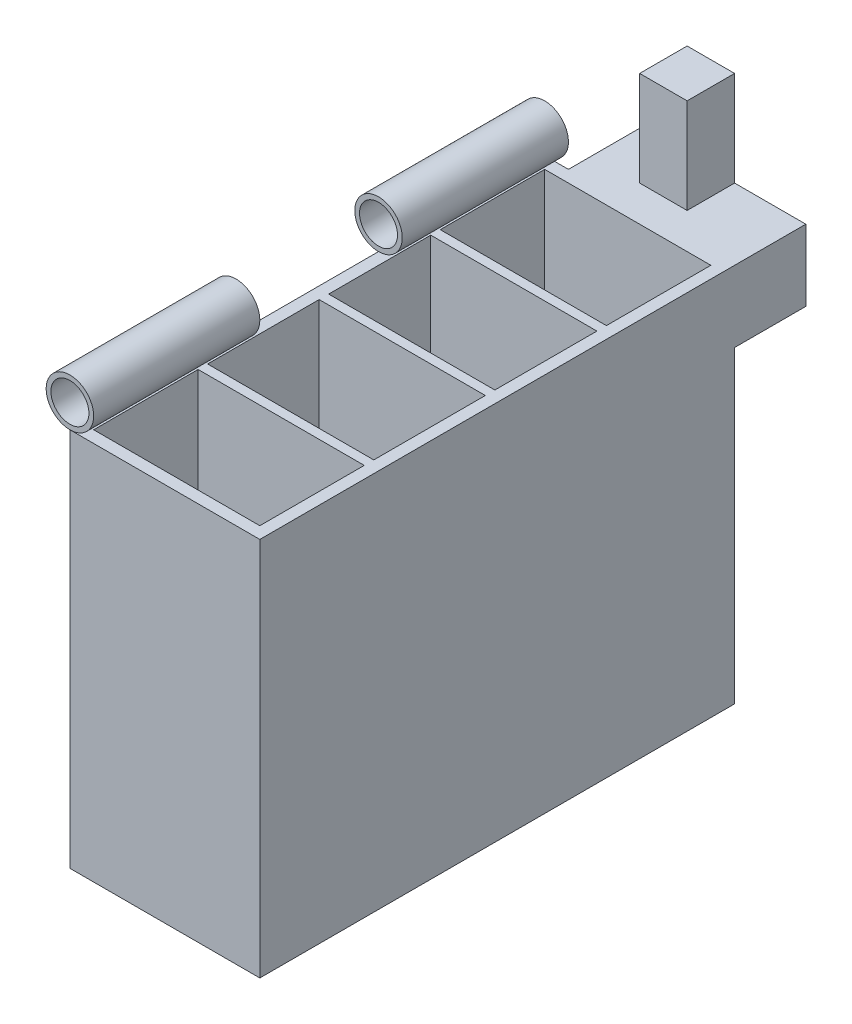
ISO-10303-21;
HEADER;
FILE_DESCRIPTION(('STEP AP214'),'2;1');
FILE_NAME('part.step','',(''),(''),'','','');
FILE_SCHEMA(('AUTOMOTIVE_DESIGN { 1 0 10303 214 1 1 1 1 }'));
ENDSEC;
DATA;
#1=APPLICATION_CONTEXT('core data for automotive mechanical design processes');
#2=APPLICATION_PROTOCOL_DEFINITION('international standard','automotive_design',2000,#1);
#3=PRODUCT_CONTEXT('',#1,'mechanical');
#4=PRODUCT('Part','Part','',(#3));
#5=PRODUCT_RELATED_PRODUCT_CATEGORY('part','',(#4));
#6=PRODUCT_DEFINITION_FORMATION('','',#4);
#7=PRODUCT_DEFINITION_CONTEXT('part definition',#1,'design');
#8=PRODUCT_DEFINITION('design','',#6,#7);
#9=PRODUCT_DEFINITION_SHAPE('','',#8);
#10=(LENGTH_UNIT() NAMED_UNIT(*) SI_UNIT(.MILLI.,.METRE.));
#11=(NAMED_UNIT(*) PLANE_ANGLE_UNIT() SI_UNIT($,.RADIAN.));
#12=(NAMED_UNIT(*) SI_UNIT($,.STERADIAN.) SOLID_ANGLE_UNIT());
#13=UNCERTAINTY_MEASURE_WITH_UNIT(LENGTH_MEASURE(1.E-05),#10,'distance_accuracy_value','');
#14=(GEOMETRIC_REPRESENTATION_CONTEXT(3) GLOBAL_UNCERTAINTY_ASSIGNED_CONTEXT((#13)) GLOBAL_UNIT_ASSIGNED_CONTEXT((#10,
#11,#12)) REPRESENTATION_CONTEXT('',''));
#15=CARTESIAN_POINT('',(0.,0.,0.));
#16=DIRECTION('',(0.,0.,1.));
#17=DIRECTION('',(1.,0.,0.));
#18=AXIS2_PLACEMENT_3D('',#15,#16,#17);
#19=CARTESIAN_POINT('',(-20.,45.,-15.));
#20=DIRECTION('',(0.,0.,-1.));
#21=DIRECTION('',(-1.,0.,0.));
#22=AXIS2_PLACEMENT_3D('',#19,#20,#21);
#23=CYLINDRICAL_SURFACE('',#22,5.);
#24=CARTESIAN_POINT('',(-20.,45.,-15.));
#25=DIRECTION('',(0.,0.,-1.));
#26=DIRECTION('',(-1.,0.,0.));
#27=AXIS2_PLACEMENT_3D('',#24,#25,#26);
#28=CIRCLE('',#27,5.);
#29=CARTESIAN_POINT('',(-25.,45.,-15.));
#30=VERTEX_POINT('',#29);
#31=EDGE_CURVE('E11',#30,#30,#28,.T.);
#32=ORIENTED_EDGE('',*,*,#31,.T.);
#33=EDGE_LOOP('',(#32));
#34=FACE_BOUND('',#33,.T.);
#35=CARTESIAN_POINT('',(-20.,45.,-50.));
#36=DIRECTION('',(0.,0.,-1.));
#37=DIRECTION('',(-1.,0.,0.));
#38=AXIS2_PLACEMENT_3D('',#35,#36,#37);
#39=CIRCLE('',#38,5.);
#40=CARTESIAN_POINT('',(-25.,45.,-50.));
#41=VERTEX_POINT('',#40);
#42=EDGE_CURVE('E44',#41,#41,#39,.T.);
#43=ORIENTED_EDGE('',*,*,#42,.F.);
#44=EDGE_LOOP('',(#43));
#45=FACE_BOUND('',#44,.T.);
#46=ADVANCED_FACE('F41',(#34,#45),#23,.T.);
#47=CARTESIAN_POINT('',(-20.,45.,-15.));
#48=DIRECTION('',(0.,0.,-1.));
#49=DIRECTION('',(-1.,0.,0.));
#50=AXIS2_PLACEMENT_3D('',#47,#48,#49);
#51=PLANE('',#50);
#52=CARTESIAN_POINT('',(-20.,45.,-15.));
#53=DIRECTION('',(0.,0.,-1.));
#54=DIRECTION('',(-1.,0.,0.));
#55=AXIS2_PLACEMENT_3D('',#52,#53,#54);
#56=CIRCLE('',#55,4.);
#57=CARTESIAN_POINT('',(-24.,45.,-15.));
#58=VERTEX_POINT('',#57);
#59=EDGE_CURVE('E51',#58,#58,#56,.T.);
#60=ORIENTED_EDGE('',*,*,#59,.T.);
#61=EDGE_LOOP('',(#60));
#62=FACE_BOUND('',#61,.T.);
#63=ORIENTED_EDGE('',*,*,#31,.F.);
#64=EDGE_LOOP('',(#63));
#65=FACE_BOUND('',#64,.T.);
#66=ADVANCED_FACE('F59',(#62,#65),#51,.F.);
#67=CARTESIAN_POINT('',(-20.,45.,-50.));
#68=DIRECTION('',(0.,0.,-1.));
#69=DIRECTION('',(-1.,0.,0.));
#70=AXIS2_PLACEMENT_3D('',#67,#68,#69);
#71=PLANE('',#70);
#72=CARTESIAN_POINT('',(-20.,45.,-50.));
#73=DIRECTION('',(0.,0.,-1.));
#74=DIRECTION('',(-1.,0.,0.));
#75=AXIS2_PLACEMENT_3D('',#72,#73,#74);
#76=CIRCLE('',#75,4.);
#77=CARTESIAN_POINT('',(-24.,45.,-50.));
#78=VERTEX_POINT('',#77);
#79=EDGE_CURVE('E53',#78,#78,#76,.T.);
#80=ORIENTED_EDGE('',*,*,#79,.F.);
#81=EDGE_LOOP('',(#80));
#82=FACE_BOUND('',#81,.T.);
#83=ORIENTED_EDGE('',*,*,#42,.T.);
#84=EDGE_LOOP('',(#83));
#85=FACE_BOUND('',#84,.T.);
#86=ADVANCED_FACE('F65',(#82,#85),#71,.T.);
#87=CARTESIAN_POINT('',(-20.,45.,-15.));
#88=DIRECTION('',(0.,0.,-1.));
#89=DIRECTION('',(-1.,0.,0.));
#90=AXIS2_PLACEMENT_3D('',#87,#88,#89);
#91=CYLINDRICAL_SURFACE('',#90,4.);
#92=ORIENTED_EDGE('',*,*,#59,.F.);
#93=EDGE_LOOP('',(#92));
#94=FACE_BOUND('',#93,.T.);
#95=ORIENTED_EDGE('',*,*,#79,.T.);
#96=EDGE_LOOP('',(#95));
#97=FACE_BOUND('',#96,.T.);
#98=ADVANCED_FACE('F62',(#94,#97),#91,.F.);
#99=CLOSED_SHELL('',(#46,#66,#86,#98));
#100=MANIFOLD_SOLID_BREP('B2',#99);
#101=CARTESIAN_POINT('',(-20.,45.,50.));
#102=DIRECTION('',(0.,0.,1.));
#103=DIRECTION('',(0.,-1.,0.));
#104=AXIS2_PLACEMENT_3D('',#101,#102,#103);
#105=CYLINDRICAL_SURFACE('',#104,5.);
#106=CARTESIAN_POINT('',(-20.,45.,15.));
#107=DIRECTION('',(0.,0.,1.));
#108=DIRECTION('',(0.,-1.,0.));
#109=AXIS2_PLACEMENT_3D('',#106,#107,#108);
#110=CIRCLE('',#109,5.);
#111=CARTESIAN_POINT('',(-20.,40.,15.));
#112=VERTEX_POINT('',#111);
#113=EDGE_CURVE('E40',#112,#112,#110,.T.);
#114=ORIENTED_EDGE('',*,*,#113,.T.);
#115=EDGE_LOOP('',(#114));
#116=FACE_BOUND('',#115,.T.);
#117=CARTESIAN_POINT('',(-20.,45.,50.));
#118=DIRECTION('',(0.,0.,1.));
#119=DIRECTION('',(0.,-1.,0.));
#120=AXIS2_PLACEMENT_3D('',#117,#118,#119);
#121=CIRCLE('',#120,5.);
#122=CARTESIAN_POINT('',(-20.,40.,50.));
#123=VERTEX_POINT('',#122);
#124=EDGE_CURVE('E117',#123,#123,#121,.T.);
#125=ORIENTED_EDGE('',*,*,#124,.F.);
#126=EDGE_LOOP('',(#125));
#127=FACE_BOUND('',#126,.T.);
#128=ADVANCED_FACE('F111',(#116,#127),#105,.T.);
#129=CARTESIAN_POINT('',(-20.,45.,15.));
#130=DIRECTION('',(0.,0.,1.));
#131=DIRECTION('',(0.,-1.,0.));
#132=AXIS2_PLACEMENT_3D('',#129,#130,#131);
#133=PLANE('',#132);
#134=CARTESIAN_POINT('',(-20.,45.,15.));
#135=DIRECTION('',(0.,0.,1.));
#136=DIRECTION('',(0.,-1.,0.));
#137=AXIS2_PLACEMENT_3D('',#134,#135,#136);
#138=CIRCLE('',#137,4.);
#139=CARTESIAN_POINT('',(-20.,41.,15.));
#140=VERTEX_POINT('',#139);
#141=EDGE_CURVE('E121',#140,#140,#138,.F.);
#142=ORIENTED_EDGE('',*,*,#141,.F.);
#143=EDGE_LOOP('',(#142));
#144=FACE_BOUND('',#143,.T.);
#145=ORIENTED_EDGE('',*,*,#113,.F.);
#146=EDGE_LOOP('',(#145));
#147=FACE_BOUND('',#146,.T.);
#148=ADVANCED_FACE('F136',(#144,#147),#133,.F.);
#149=CARTESIAN_POINT('',(-20.,50.,50.));
#150=DIRECTION('',(0.,0.,-1.));
#151=DIRECTION('',(0.,1.,0.));
#152=AXIS2_PLACEMENT_3D('',#149,#150,#151);
#153=PLANE('',#152);
#154=CARTESIAN_POINT('',(-20.,45.,50.));
#155=DIRECTION('',(0.,0.,1.));
#156=DIRECTION('',(1.,0.,0.));
#157=AXIS2_PLACEMENT_3D('',#154,#155,#156);
#158=CIRCLE('',#157,4.);
#159=CARTESIAN_POINT('',(-16.,45.,50.));
#160=VERTEX_POINT('',#159);
#161=EDGE_CURVE('E125',#160,#160,#158,.T.);
#162=ORIENTED_EDGE('',*,*,#161,.F.);
#163=EDGE_LOOP('',(#162));
#164=FACE_BOUND('',#163,.T.);
#165=ORIENTED_EDGE('',*,*,#124,.T.);
#166=EDGE_LOOP('',(#165));
#167=FACE_BOUND('',#166,.T.);
#168=ADVANCED_FACE('F134',(#164,#167),#153,.F.);
#169=CARTESIAN_POINT('',(-20.,45.,-50.001));
#170=DIRECTION('',(0.,0.,1.));
#171=DIRECTION('',(1.,0.,0.));
#172=AXIS2_PLACEMENT_3D('',#169,#170,#171);
#173=CYLINDRICAL_SURFACE('',#172,4.);
#174=ORIENTED_EDGE('',*,*,#161,.T.);
#175=EDGE_LOOP('',(#174));
#176=FACE_BOUND('',#175,.T.);
#177=ORIENTED_EDGE('',*,*,#141,.T.);
#178=EDGE_LOOP('',(#177));
#179=FACE_BOUND('',#178,.T.);
#180=ADVANCED_FACE('F131',(#176,#179),#173,.F.);
#181=CLOSED_SHELL('',(#128,#148,#168,#180));
#182=MANIFOLD_SOLID_BREP('B6',#181);
#183=CARTESIAN_POINT('',(-20.,40.,50.));
#184=DIRECTION('',(0.,-1.,0.));
#185=DIRECTION('',(0.,0.,-1.));
#186=AXIS2_PLACEMENT_3D('',#183,#184,#185);
#187=PLANE('',#186);
#188=DIRECTION('',(1.,0.,0.));
#189=VECTOR('',#188,1.);
#190=CARTESIAN_POINT('',(-15.,40.,-65.));
#191=LINE('',#190,#189);
#192=CARTESIAN_POINT('',(5.,40.,-65.));
#193=VERTEX_POINT('',#192);
#194=CARTESIAN_POINT('',(20.,40.,-65.));
#195=VERTEX_POINT('',#194);
#196=EDGE_CURVE('E410',#193,#195,#191,.T.);
#197=ORIENTED_EDGE('',*,*,#196,.F.);
#198=DIRECTION('',(0.,0.,1.));
#199=VECTOR('',#198,1.);
#200=CARTESIAN_POINT('',(5.,40.,50.));
#201=LINE('',#200,#199);
#202=CARTESIAN_POINT('',(5.,40.,-55.));
#203=VERTEX_POINT('',#202);
#204=EDGE_CURVE('E386',#193,#203,#201,.T.);
#205=ORIENTED_EDGE('',*,*,#204,.T.);
#206=DIRECTION('',(-1.,0.,0.));
#207=VECTOR('',#206,1.);
#208=CARTESIAN_POINT('',(-20.,40.,-55.));
#209=LINE('',#208,#207);
#210=CARTESIAN_POINT('',(-5.,40.,-55.));
#211=VERTEX_POINT('',#210);
#212=EDGE_CURVE('E382',#203,#211,#209,.T.);
#213=ORIENTED_EDGE('',*,*,#212,.T.);
#214=DIRECTION('',(0.,0.,-1.));
#215=VECTOR('',#214,1.);
#216=CARTESIAN_POINT('',(-5.,40.,50.));
#217=LINE('',#216,#215);
#218=CARTESIAN_POINT('',(-5.,40.,-65.));
#219=VERTEX_POINT('',#218);
#220=EDGE_CURVE('E359',#211,#219,#217,.T.);
#221=ORIENTED_EDGE('',*,*,#220,.T.);
#222=CARTESIAN_POINT('',(-15.,40.,-65.));
#223=VERTEX_POINT('',#222);
#224=EDGE_CURVE('E406',#223,#219,#191,.T.);
#225=ORIENTED_EDGE('',*,*,#224,.F.);
#226=DIRECTION('',(0.,0.,1.));
#227=VECTOR('',#226,1.);
#228=CARTESIAN_POINT('',(-15.,40.,-50.));
#229=LINE('',#228,#227);
#230=CARTESIAN_POINT('',(-15.,40.,-50.));
#231=VERTEX_POINT('',#230);
#232=EDGE_CURVE('E399',#223,#231,#229,.T.);
#233=ORIENTED_EDGE('',*,*,#232,.T.);
#234=DIRECTION('',(-1.,0.,0.));
#235=VECTOR('',#234,1.);
#236=CARTESIAN_POINT('',(-20.,40.,-50.));
#237=LINE('',#236,#235);
#238=CARTESIAN_POINT('',(-20.,40.,-50.));
#239=VERTEX_POINT('',#238);
#240=EDGE_CURVE('E551',#231,#239,#237,.T.);
#241=ORIENTED_EDGE('',*,*,#240,.T.);
#242=DIRECTION('',(0.,0.,-1.));
#243=VECTOR('',#242,1.);
#244=CARTESIAN_POINT('',(-20.,40.,50.));
#245=LINE('',#244,#243);
#246=CARTESIAN_POINT('',(-20.,40.,50.));
#247=VERTEX_POINT('',#246);
#248=EDGE_CURVE('E181',#247,#239,#245,.T.);
#249=ORIENTED_EDGE('',*,*,#248,.F.);
#250=DIRECTION('',(-1.,0.,0.));
#251=VECTOR('',#250,1.);
#252=CARTESIAN_POINT('',(-20.,40.,50.));
#253=LINE('',#252,#251);
#254=CARTESIAN_POINT('',(20.,40.,50.));
#255=VERTEX_POINT('',#254);
#256=EDGE_CURVE('E541',#255,#247,#253,.T.);
#257=ORIENTED_EDGE('',*,*,#256,.F.);
#258=DIRECTION('',(0.,0.,-1.));
#259=VECTOR('',#258,1.);
#260=CARTESIAN_POINT('',(20.,40.,50.));
#261=LINE('',#260,#259);
#262=EDGE_CURVE('E109',#255,#195,#261,.T.);
#263=ORIENTED_EDGE('',*,*,#262,.T.);
#264=EDGE_LOOP('',(#197,#205,#213,#221,#225,#233,#241,#249,#257,#263));
#265=FACE_BOUND('',#264,.T.);
#266=DIRECTION('',(-1.,0.,0.));
#267=VECTOR('',#266,1.);
#268=CARTESIAN_POINT('',(0.,40.,23.5));
#269=LINE('',#268,#267);
#270=CARTESIAN_POINT('',(17.5,40.,23.5));
#271=VERTEX_POINT('',#270);
#272=CARTESIAN_POINT('',(-17.5,40.,23.5));
#273=VERTEX_POINT('',#272);
#274=EDGE_CURVE('E460',#271,#273,#269,.T.);
#275=ORIENTED_EDGE('',*,*,#274,.T.);
#276=DIRECTION('',(0.,0.,1.));
#277=VECTOR('',#276,1.);
#278=CARTESIAN_POINT('',(-17.5,40.,0.));
#279=LINE('',#278,#277);
#280=CARTESIAN_POINT('',(-17.5,40.,0.));
#281=VERTEX_POINT('',#280);
#282=EDGE_CURVE('E451',#281,#273,#279,.T.);
#283=ORIENTED_EDGE('',*,*,#282,.F.);
#284=DIRECTION('',(-1.,0.,0.));
#285=VECTOR('',#284,1.);
#286=CARTESIAN_POINT('',(0.,40.,0.));
#287=LINE('',#286,#285);
#288=CARTESIAN_POINT('',(17.5,40.,0.));
#289=VERTEX_POINT('',#288);
#290=EDGE_CURVE('E467',#289,#281,#287,.T.);
#291=ORIENTED_EDGE('',*,*,#290,.F.);
#292=DIRECTION('',(0.,0.,1.));
#293=VECTOR('',#292,1.);
#294=CARTESIAN_POINT('',(17.5,40.,0.));
#295=LINE('',#294,#293);
#296=EDGE_CURVE('E463',#289,#271,#295,.T.);
#297=ORIENTED_EDGE('',*,*,#296,.T.);
#298=EDGE_LOOP('',(#275,#283,#291,#297));
#299=FACE_BOUND('',#298,.T.);
#300=DIRECTION('',(-1.,0.,0.));
#301=VECTOR('',#300,1.);
#302=CARTESIAN_POINT('',(0.,40.,-25.5));
#303=LINE('',#302,#301);
#304=CARTESIAN_POINT('',(17.5,40.,-25.5));
#305=VERTEX_POINT('',#304);
#306=CARTESIAN_POINT('',(-17.5,40.,-25.5));
#307=VERTEX_POINT('',#306);
#308=EDGE_CURVE('E409',#305,#307,#303,.T.);
#309=ORIENTED_EDGE('',*,*,#308,.T.);
#310=DIRECTION('',(0.,0.,1.));
#311=VECTOR('',#310,1.);
#312=CARTESIAN_POINT('',(-17.5,40.,0.));
#313=LINE('',#312,#311);
#314=CARTESIAN_POINT('',(-17.5,40.,-47.5));
#315=VERTEX_POINT('',#314);
#316=EDGE_CURVE('E513',#315,#307,#313,.T.);
#317=ORIENTED_EDGE('',*,*,#316,.F.);
#318=DIRECTION('',(1.,0.,0.));
#319=VECTOR('',#318,1.);
#320=CARTESIAN_POINT('',(0.,40.,-47.5));
#321=LINE('',#320,#319);
#322=CARTESIAN_POINT('',(17.5,40.,-47.5));
#323=VERTEX_POINT('',#322);
#324=EDGE_CURVE('E526',#315,#323,#321,.T.);
#325=ORIENTED_EDGE('',*,*,#324,.T.);
#326=DIRECTION('',(0.,0.,1.));
#327=VECTOR('',#326,1.);
#328=CARTESIAN_POINT('',(17.5,40.,0.));
#329=LINE('',#328,#327);
#330=EDGE_CURVE('E523',#323,#305,#329,.T.);
#331=ORIENTED_EDGE('',*,*,#330,.T.);
#332=EDGE_LOOP('',(#309,#317,#325,#331));
#333=FACE_BOUND('',#332,.T.);
#334=DIRECTION('',(-1.,0.,0.));
#335=VECTOR('',#334,1.);
#336=CARTESIAN_POINT('',(0.,40.,-2.00000000000003));
#337=LINE('',#336,#335);
#338=CARTESIAN_POINT('',(17.5,40.,-2.00000000000003));
#339=VERTEX_POINT('',#338);
#340=CARTESIAN_POINT('',(-17.5,40.,-2.00000000000003));
#341=VERTEX_POINT('',#340);
#342=EDGE_CURVE('E491',#339,#341,#337,.T.);
#343=ORIENTED_EDGE('',*,*,#342,.T.);
#344=DIRECTION('',(0.,0.,1.));
#345=VECTOR('',#344,1.);
#346=CARTESIAN_POINT('',(-17.5,40.,0.));
#347=LINE('',#346,#345);
#348=CARTESIAN_POINT('',(-17.5,40.,-23.5));
#349=VERTEX_POINT('',#348);
#350=EDGE_CURVE('E482',#349,#341,#347,.T.);
#351=ORIENTED_EDGE('',*,*,#350,.F.);
#352=DIRECTION('',(-1.,0.,0.));
#353=VECTOR('',#352,1.);
#354=CARTESIAN_POINT('',(0.,40.,-23.5));
#355=LINE('',#354,#353);
#356=CARTESIAN_POINT('',(17.5,40.,-23.5));
#357=VERTEX_POINT('',#356);
#358=EDGE_CURVE('E498',#357,#349,#355,.T.);
#359=ORIENTED_EDGE('',*,*,#358,.F.);
#360=DIRECTION('',(0.,0.,1.));
#361=VECTOR('',#360,1.);
#362=CARTESIAN_POINT('',(17.5,40.,0.));
#363=LINE('',#362,#361);
#364=EDGE_CURVE('E494',#357,#339,#363,.T.);
#365=ORIENTED_EDGE('',*,*,#364,.T.);
#366=EDGE_LOOP('',(#343,#351,#359,#365));
#367=FACE_BOUND('',#366,.T.);
#368=DIRECTION('',(0.,0.,1.));
#369=VECTOR('',#368,1.);
#370=CARTESIAN_POINT('',(17.5,40.,0.));
#371=LINE('',#370,#369);
#372=CARTESIAN_POINT('',(17.5,40.,25.5));
#373=VERTEX_POINT('',#372);
#374=CARTESIAN_POINT('',(17.5,40.,47.5));
#375=VERTEX_POINT('',#374);
#376=EDGE_CURVE('E427',#373,#375,#371,.T.);
#377=ORIENTED_EDGE('',*,*,#376,.T.);
#378=DIRECTION('',(1.,0.,0.));
#379=VECTOR('',#378,1.);
#380=CARTESIAN_POINT('',(0.,40.,47.5));
#381=LINE('',#380,#379);
#382=CARTESIAN_POINT('',(-17.5,40.,47.5));
#383=VERTEX_POINT('',#382);
#384=EDGE_CURVE('E417',#383,#375,#381,.T.);
#385=ORIENTED_EDGE('',*,*,#384,.F.);
#386=DIRECTION('',(0.,0.,1.));
#387=VECTOR('',#386,1.);
#388=CARTESIAN_POINT('',(-17.5,40.,0.));
#389=LINE('',#388,#387);
#390=CARTESIAN_POINT('',(-17.5,40.,25.5));
#391=VERTEX_POINT('',#390);
#392=EDGE_CURVE('E434',#391,#383,#389,.T.);
#393=ORIENTED_EDGE('',*,*,#392,.F.);
#394=DIRECTION('',(-1.,0.,0.));
#395=VECTOR('',#394,1.);
#396=CARTESIAN_POINT('',(0.,40.,25.5));
#397=LINE('',#396,#395);
#398=EDGE_CURVE('E430',#373,#391,#397,.T.);
#399=ORIENTED_EDGE('',*,*,#398,.F.);
#400=EDGE_LOOP('',(#377,#385,#393,#399));
#401=FACE_BOUND('',#400,.T.);
#402=ADVANCED_FACE('F173',(#265,#299,#333,#367,#401),#187,.F.);
#403=CARTESIAN_POINT('',(20.,40.,50.));
#404=DIRECTION('',(-1.,0.,0.));
#405=DIRECTION('',(0.,-1.,0.));
#406=AXIS2_PLACEMENT_3D('',#403,#404,#405);
#407=PLANE('',#406);
#408=DIRECTION('',(0.,1.,0.));
#409=VECTOR('',#408,1.);
#410=CARTESIAN_POINT('',(20.,40.,-50.));
#411=LINE('',#410,#409);
#412=CARTESIAN_POINT('',(20.,-40.,-50.));
#413=VERTEX_POINT('',#412);
#414=CARTESIAN_POINT('',(20.,25.,-50.));
#415=VERTEX_POINT('',#414);
#416=EDGE_CURVE('E441',#413,#415,#411,.T.);
#417=ORIENTED_EDGE('',*,*,#416,.T.);
#418=DIRECTION('',(0.,0.,-1.));
#419=VECTOR('',#418,1.);
#420=CARTESIAN_POINT('',(20.,25.,-50.));
#421=LINE('',#420,#419);
#422=CARTESIAN_POINT('',(20.,25.,-65.));
#423=VERTEX_POINT('',#422);
#424=EDGE_CURVE('E196',#415,#423,#421,.T.);
#425=ORIENTED_EDGE('',*,*,#424,.T.);
#426=DIRECTION('',(0.,1.,0.));
#427=VECTOR('',#426,1.);
#428=CARTESIAN_POINT('',(20.,40.,-65.));
#429=LINE('',#428,#427);
#430=EDGE_CURVE('E393',#423,#195,#429,.T.);
#431=ORIENTED_EDGE('',*,*,#430,.T.);
#432=ORIENTED_EDGE('',*,*,#262,.F.);
#433=DIRECTION('',(0.,1.,0.));
#434=VECTOR('',#433,1.);
#435=CARTESIAN_POINT('',(20.,40.,50.));
#436=LINE('',#435,#434);
#437=CARTESIAN_POINT('',(20.,-40.,50.));
#438=VERTEX_POINT('',#437);
#439=EDGE_CURVE('E538',#438,#255,#436,.T.);
#440=ORIENTED_EDGE('',*,*,#439,.F.);
#441=DIRECTION('',(0.,0.,-1.));
#442=VECTOR('',#441,1.);
#443=CARTESIAN_POINT('',(20.,-40.,50.));
#444=LINE('',#443,#442);
#445=EDGE_CURVE('E548',#438,#413,#444,.T.);
#446=ORIENTED_EDGE('',*,*,#445,.T.);
#447=EDGE_LOOP('',(#417,#425,#431,#432,#440,#446));
#448=FACE_BOUND('',#447,.T.);
#449=ADVANCED_FACE('F175',(#448),#407,.F.);
#450=CARTESIAN_POINT('',(-20.,40.,50.));
#451=DIRECTION('',(1.,0.,0.));
#452=DIRECTION('',(0.,1.,0.));
#453=AXIS2_PLACEMENT_3D('',#450,#451,#452);
#454=PLANE('',#453);
#455=DIRECTION('',(0.,-1.,0.));
#456=VECTOR('',#455,1.);
#457=CARTESIAN_POINT('',(-20.,40.,-50.));
#458=LINE('',#457,#456);
#459=CARTESIAN_POINT('',(-20.,-40.,-50.));
#460=VERTEX_POINT('',#459);
#461=EDGE_CURVE('E553',#239,#460,#458,.T.);
#462=ORIENTED_EDGE('',*,*,#461,.T.);
#463=DIRECTION('',(0.,0.,-1.));
#464=VECTOR('',#463,1.);
#465=CARTESIAN_POINT('',(-20.,-40.,50.));
#466=LINE('',#465,#464);
#467=CARTESIAN_POINT('',(-20.,-40.,50.));
#468=VERTEX_POINT('',#467);
#469=EDGE_CURVE('E558',#468,#460,#466,.T.);
#470=ORIENTED_EDGE('',*,*,#469,.F.);
#471=DIRECTION('',(0.,-1.,0.));
#472=VECTOR('',#471,1.);
#473=CARTESIAN_POINT('',(-20.,40.,50.));
#474=LINE('',#473,#472);
#475=EDGE_CURVE('E544',#247,#468,#474,.T.);
#476=ORIENTED_EDGE('',*,*,#475,.F.);
#477=ORIENTED_EDGE('',*,*,#248,.T.);
#478=EDGE_LOOP('',(#462,#470,#476,#477));
#479=FACE_BOUND('',#478,.T.);
#480=ADVANCED_FACE('F565',(#479),#454,.F.);
#481=CARTESIAN_POINT('',(-20.,-40.,50.));
#482=DIRECTION('',(0.,1.,0.));
#483=DIRECTION('',(0.,0.,1.));
#484=AXIS2_PLACEMENT_3D('',#481,#482,#483);
#485=PLANE('',#484);
#486=DIRECTION('',(1.,0.,0.));
#487=VECTOR('',#486,1.);
#488=CARTESIAN_POINT('',(-20.,-40.,-50.));
#489=LINE('',#488,#487);
#490=EDGE_CURVE('E542',#460,#413,#489,.T.);
#491=ORIENTED_EDGE('',*,*,#490,.T.);
#492=ORIENTED_EDGE('',*,*,#445,.F.);
#493=DIRECTION('',(1.,0.,0.));
#494=VECTOR('',#493,1.);
#495=CARTESIAN_POINT('',(-20.,-40.,50.));
#496=LINE('',#495,#494);
#497=EDGE_CURVE('E546',#468,#438,#496,.T.);
#498=ORIENTED_EDGE('',*,*,#497,.F.);
#499=ORIENTED_EDGE('',*,*,#469,.T.);
#500=EDGE_LOOP('',(#491,#492,#498,#499));
#501=FACE_BOUND('',#500,.T.);
#502=ADVANCED_FACE('F575',(#501),#485,.F.);
#503=CARTESIAN_POINT('',(0.,0.,50.));
#504=DIRECTION('',(0.,0.,1.));
#505=DIRECTION('',(1.,0.,0.));
#506=AXIS2_PLACEMENT_3D('',#503,#504,#505);
#507=PLANE('',#506);
#508=ORIENTED_EDGE('',*,*,#439,.T.);
#509=ORIENTED_EDGE('',*,*,#256,.T.);
#510=ORIENTED_EDGE('',*,*,#475,.T.);
#511=ORIENTED_EDGE('',*,*,#497,.T.);
#512=EDGE_LOOP('',(#508,#509,#510,#511));
#513=FACE_BOUND('',#512,.T.);
#514=ADVANCED_FACE('F581',(#513),#507,.T.);
#515=CARTESIAN_POINT('',(0.,0.,-50.));
#516=DIRECTION('',(0.,0.,1.));
#517=DIRECTION('',(1.,0.,0.));
#518=AXIS2_PLACEMENT_3D('',#515,#516,#517);
#519=PLANE('',#518);
#520=ORIENTED_EDGE('',*,*,#240,.F.);
#521=DIRECTION('',(0.,-1.,0.));
#522=VECTOR('',#521,1.);
#523=CARTESIAN_POINT('',(-15.,40.,-50.));
#524=LINE('',#523,#522);
#525=CARTESIAN_POINT('',(-15.,25.,-50.));
#526=VERTEX_POINT('',#525);
#527=EDGE_CURVE('E389',#231,#526,#524,.T.);
#528=ORIENTED_EDGE('',*,*,#527,.T.);
#529=DIRECTION('',(1.,0.,0.));
#530=VECTOR('',#529,1.);
#531=CARTESIAN_POINT('',(-15.,25.,-50.));
#532=LINE('',#531,#530);
#533=EDGE_CURVE('E402',#526,#415,#532,.T.);
#534=ORIENTED_EDGE('',*,*,#533,.T.);
#535=ORIENTED_EDGE('',*,*,#416,.F.);
#536=ORIENTED_EDGE('',*,*,#490,.F.);
#537=ORIENTED_EDGE('',*,*,#461,.F.);
#538=EDGE_LOOP('',(#520,#528,#534,#535,#536,#537));
#539=FACE_BOUND('',#538,.T.);
#540=ADVANCED_FACE('F571',(#539),#519,.F.);
#541=CARTESIAN_POINT('',(0.,-35.,-25.5));
#542=DIRECTION('',(0.,0.,-1.));
#543=DIRECTION('',(-1.,0.,0.));
#544=AXIS2_PLACEMENT_3D('',#541,#542,#543);
#545=PLANE('',#544);
#546=ORIENTED_EDGE('',*,*,#308,.F.);
#547=DIRECTION('',(0.,1.,0.));
#548=VECTOR('',#547,1.);
#549=CARTESIAN_POINT('',(17.5,-35.,-25.5));
#550=LINE('',#549,#548);
#551=CARTESIAN_POINT('',(17.5,-35.,-25.5));
#552=VERTEX_POINT('',#551);
#553=EDGE_CURVE('E520',#552,#305,#550,.T.);
#554=ORIENTED_EDGE('',*,*,#553,.F.);
#555=DIRECTION('',(-1.,0.,0.));
#556=VECTOR('',#555,1.);
#557=CARTESIAN_POINT('',(0.,-35.,-25.5));
#558=LINE('',#557,#556);
#559=CARTESIAN_POINT('',(-17.5,-35.,-25.5));
#560=VERTEX_POINT('',#559);
#561=EDGE_CURVE('E510',#552,#560,#558,.T.);
#562=ORIENTED_EDGE('',*,*,#561,.T.);
#563=DIRECTION('',(0.,1.,0.));
#564=VECTOR('',#563,1.);
#565=CARTESIAN_POINT('',(-17.5,-35.,-25.5));
#566=LINE('',#565,#564);
#567=EDGE_CURVE('E495',#560,#307,#566,.T.);
#568=ORIENTED_EDGE('',*,*,#567,.T.);
#569=EDGE_LOOP('',(#546,#554,#562,#568));
#570=FACE_BOUND('',#569,.T.);
#571=ADVANCED_FACE('F613',(#570),#545,.T.);
#572=CARTESIAN_POINT('',(-17.5,-35.,0.));
#573=DIRECTION('',(-1.,0.,0.));
#574=DIRECTION('',(0.,0.,1.));
#575=AXIS2_PLACEMENT_3D('',#572,#573,#574);
#576=PLANE('',#575);
#577=ORIENTED_EDGE('',*,*,#316,.T.);
#578=ORIENTED_EDGE('',*,*,#567,.F.);
#579=DIRECTION('',(0.,0.,1.));
#580=VECTOR('',#579,1.);
#581=CARTESIAN_POINT('',(-17.5,-35.,0.));
#582=LINE('',#581,#580);
#583=CARTESIAN_POINT('',(-17.5,-35.,-47.5));
#584=VERTEX_POINT('',#583);
#585=EDGE_CURVE('E517',#584,#560,#582,.T.);
#586=ORIENTED_EDGE('',*,*,#585,.F.);
#587=DIRECTION('',(0.,1.,0.));
#588=VECTOR('',#587,1.);
#589=CARTESIAN_POINT('',(-17.5,-35.,-47.5));
#590=LINE('',#589,#588);
#591=EDGE_CURVE('E532',#584,#315,#590,.T.);
#592=ORIENTED_EDGE('',*,*,#591,.T.);
#593=EDGE_LOOP('',(#577,#578,#586,#592));
#594=FACE_BOUND('',#593,.T.);
#595=ADVANCED_FACE('F618',(#594),#576,.F.);
#596=CARTESIAN_POINT('',(0.,-35.,-47.5));
#597=DIRECTION('',(0.,0.,1.));
#598=DIRECTION('',(1.,0.,0.));
#599=AXIS2_PLACEMENT_3D('',#596,#597,#598);
#600=PLANE('',#599);
#601=ORIENTED_EDGE('',*,*,#324,.F.);
#602=ORIENTED_EDGE('',*,*,#591,.F.);
#603=DIRECTION('',(1.,0.,0.));
#604=VECTOR('',#603,1.);
#605=CARTESIAN_POINT('',(0.,-35.,-47.5));
#606=LINE('',#605,#604);
#607=CARTESIAN_POINT('',(17.5,-35.,-47.5));
#608=VERTEX_POINT('',#607);
#609=EDGE_CURVE('E515',#584,#608,#606,.T.);
#610=ORIENTED_EDGE('',*,*,#609,.T.);
#611=DIRECTION('',(0.,1.,0.));
#612=VECTOR('',#611,1.);
#613=CARTESIAN_POINT('',(17.5,-35.,-47.5));
#614=LINE('',#613,#612);
#615=EDGE_CURVE('E534',#608,#323,#614,.T.);
#616=ORIENTED_EDGE('',*,*,#615,.T.);
#617=EDGE_LOOP('',(#601,#602,#610,#616));
#618=FACE_BOUND('',#617,.T.);
#619=ADVANCED_FACE('F624',(#618),#600,.T.);
#620=CARTESIAN_POINT('',(17.5,-35.,0.));
#621=DIRECTION('',(-1.,0.,0.));
#622=DIRECTION('',(0.,0.,1.));
#623=AXIS2_PLACEMENT_3D('',#620,#621,#622);
#624=PLANE('',#623);
#625=ORIENTED_EDGE('',*,*,#330,.F.);
#626=ORIENTED_EDGE('',*,*,#615,.F.);
#627=DIRECTION('',(0.,0.,1.));
#628=VECTOR('',#627,1.);
#629=CARTESIAN_POINT('',(17.5,-35.,0.));
#630=LINE('',#629,#628);
#631=EDGE_CURVE('E512',#608,#552,#630,.T.);
#632=ORIENTED_EDGE('',*,*,#631,.T.);
#633=ORIENTED_EDGE('',*,*,#553,.T.);
#634=EDGE_LOOP('',(#625,#626,#632,#633));
#635=FACE_BOUND('',#634,.T.);
#636=ADVANCED_FACE('F620',(#635),#624,.T.);
#637=CARTESIAN_POINT('',(0.,-35.,0.));
#638=DIRECTION('',(0.,1.,0.));
#639=DIRECTION('',(0.,0.,1.));
#640=AXIS2_PLACEMENT_3D('',#637,#638,#639);
#641=PLANE('',#640);
#642=ORIENTED_EDGE('',*,*,#561,.F.);
#643=ORIENTED_EDGE('',*,*,#631,.F.);
#644=ORIENTED_EDGE('',*,*,#609,.F.);
#645=ORIENTED_EDGE('',*,*,#585,.T.);
#646=EDGE_LOOP('',(#642,#643,#644,#645));
#647=FACE_BOUND('',#646,.T.);
#648=ADVANCED_FACE('F623',(#647),#641,.T.);
#649=CARTESIAN_POINT('',(0.,-35.,-2.00000000000003));
#650=DIRECTION('',(0.,0.,-1.));
#651=DIRECTION('',(-1.,0.,0.));
#652=AXIS2_PLACEMENT_3D('',#649,#650,#651);
#653=PLANE('',#652);
#654=ORIENTED_EDGE('',*,*,#342,.F.);
#655=DIRECTION('',(0.,1.,0.));
#656=VECTOR('',#655,1.);
#657=CARTESIAN_POINT('',(17.5,-35.,-2.00000000000003));
#658=LINE('',#657,#656);
#659=CARTESIAN_POINT('',(17.5,-35.,-2.00000000000003));
#660=VERTEX_POINT('',#659);
#661=EDGE_CURVE('E490',#660,#339,#658,.T.);
#662=ORIENTED_EDGE('',*,*,#661,.F.);
#663=DIRECTION('',(-1.,0.,0.));
#664=VECTOR('',#663,1.);
#665=CARTESIAN_POINT('',(0.,-35.,-2.00000000000003));
#666=LINE('',#665,#664);
#667=CARTESIAN_POINT('',(-17.5,-35.,-2.00000000000003));
#668=VERTEX_POINT('',#667);
#669=EDGE_CURVE('E479',#660,#668,#666,.T.);
#670=ORIENTED_EDGE('',*,*,#669,.T.);
#671=DIRECTION('',(0.,1.,0.));
#672=VECTOR('',#671,1.);
#673=CARTESIAN_POINT('',(-17.5,-35.,-2.00000000000003));
#674=LINE('',#673,#672);
#675=EDGE_CURVE('E464',#668,#341,#674,.T.);
#676=ORIENTED_EDGE('',*,*,#675,.T.);
#677=EDGE_LOOP('',(#654,#662,#670,#676));
#678=FACE_BOUND('',#677,.T.);
#679=ADVANCED_FACE('F634',(#678),#653,.T.);
#680=CARTESIAN_POINT('',(-17.5,-35.,0.));
#681=DIRECTION('',(-1.,0.,0.));
#682=DIRECTION('',(0.,0.,1.));
#683=AXIS2_PLACEMENT_3D('',#680,#681,#682);
#684=PLANE('',#683);
#685=ORIENTED_EDGE('',*,*,#350,.T.);
#686=ORIENTED_EDGE('',*,*,#675,.F.);
#687=DIRECTION('',(0.,0.,1.));
#688=VECTOR('',#687,1.);
#689=CARTESIAN_POINT('',(-17.5,-35.,0.));
#690=LINE('',#689,#688);
#691=CARTESIAN_POINT('',(-17.5,-35.,-23.5));
#692=VERTEX_POINT('',#691);
#693=EDGE_CURVE('E487',#692,#668,#690,.T.);
#694=ORIENTED_EDGE('',*,*,#693,.F.);
#695=DIRECTION('',(0.,1.,0.));
#696=VECTOR('',#695,1.);
#697=CARTESIAN_POINT('',(-17.5,-35.,-23.5));
#698=LINE('',#697,#696);
#699=EDGE_CURVE('E504',#692,#349,#698,.T.);
#700=ORIENTED_EDGE('',*,*,#699,.T.);
#701=EDGE_LOOP('',(#685,#686,#694,#700));
#702=FACE_BOUND('',#701,.T.);
#703=ADVANCED_FACE('F638',(#702),#684,.F.);
#704=CARTESIAN_POINT('',(0.,-35.,-23.5));
#705=DIRECTION('',(0.,0.,-1.));
#706=DIRECTION('',(-1.,0.,0.));
#707=AXIS2_PLACEMENT_3D('',#704,#705,#706);
#708=PLANE('',#707);
#709=ORIENTED_EDGE('',*,*,#358,.T.);
#710=ORIENTED_EDGE('',*,*,#699,.F.);
#711=DIRECTION('',(-1.,0.,0.));
#712=VECTOR('',#711,1.);
#713=CARTESIAN_POINT('',(0.,-35.,-23.5));
#714=LINE('',#713,#712);
#715=CARTESIAN_POINT('',(17.5,-35.,-23.5));
#716=VERTEX_POINT('',#715);
#717=EDGE_CURVE('E484',#716,#692,#714,.T.);
#718=ORIENTED_EDGE('',*,*,#717,.F.);
#719=DIRECTION('',(0.,1.,0.));
#720=VECTOR('',#719,1.);
#721=CARTESIAN_POINT('',(17.5,-35.,-23.5));
#722=LINE('',#721,#720);
#723=EDGE_CURVE('E506',#716,#357,#722,.T.);
#724=ORIENTED_EDGE('',*,*,#723,.T.);
#725=EDGE_LOOP('',(#709,#710,#718,#724));
#726=FACE_BOUND('',#725,.T.);
#727=ADVANCED_FACE('F644',(#726),#708,.F.);
#728=CARTESIAN_POINT('',(17.5,-35.,0.));
#729=DIRECTION('',(-1.,0.,0.));
#730=DIRECTION('',(0.,0.,1.));
#731=AXIS2_PLACEMENT_3D('',#728,#729,#730);
#732=PLANE('',#731);
#733=ORIENTED_EDGE('',*,*,#364,.F.);
#734=ORIENTED_EDGE('',*,*,#723,.F.);
#735=DIRECTION('',(0.,0.,1.));
#736=VECTOR('',#735,1.);
#737=CARTESIAN_POINT('',(17.5,-35.,0.));
#738=LINE('',#737,#736);
#739=EDGE_CURVE('E481',#716,#660,#738,.T.);
#740=ORIENTED_EDGE('',*,*,#739,.T.);
#741=ORIENTED_EDGE('',*,*,#661,.T.);
#742=EDGE_LOOP('',(#733,#734,#740,#741));
#743=FACE_BOUND('',#742,.T.);
#744=ADVANCED_FACE('F640',(#743),#732,.T.);
#745=CARTESIAN_POINT('',(0.,-35.,0.));
#746=DIRECTION('',(0.,1.,0.));
#747=DIRECTION('',(0.,0.,1.));
#748=AXIS2_PLACEMENT_3D('',#745,#746,#747);
#749=PLANE('',#748);
#750=ORIENTED_EDGE('',*,*,#669,.F.);
#751=ORIENTED_EDGE('',*,*,#739,.F.);
#752=ORIENTED_EDGE('',*,*,#717,.T.);
#753=ORIENTED_EDGE('',*,*,#693,.T.);
#754=EDGE_LOOP('',(#750,#751,#752,#753));
#755=FACE_BOUND('',#754,.T.);
#756=ADVANCED_FACE('F643',(#755),#749,.T.);
#757=CARTESIAN_POINT('',(0.,-35.,23.5));
#758=DIRECTION('',(0.,0.,-1.));
#759=DIRECTION('',(-1.,0.,0.));
#760=AXIS2_PLACEMENT_3D('',#757,#758,#759);
#761=PLANE('',#760);
#762=ORIENTED_EDGE('',*,*,#274,.F.);
#763=DIRECTION('',(0.,1.,0.));
#764=VECTOR('',#763,1.);
#765=CARTESIAN_POINT('',(17.5,-35.,23.5));
#766=LINE('',#765,#764);
#767=CARTESIAN_POINT('',(17.5,-35.,23.5));
#768=VERTEX_POINT('',#767);
#769=EDGE_CURVE('E459',#768,#271,#766,.T.);
#770=ORIENTED_EDGE('',*,*,#769,.F.);
#771=DIRECTION('',(-1.,0.,0.));
#772=VECTOR('',#771,1.);
#773=CARTESIAN_POINT('',(0.,-35.,23.5));
#774=LINE('',#773,#772);
#775=CARTESIAN_POINT('',(-17.5,-35.,23.5));
#776=VERTEX_POINT('',#775);
#777=EDGE_CURVE('E448',#768,#776,#774,.T.);
#778=ORIENTED_EDGE('',*,*,#777,.T.);
#779=DIRECTION('',(0.,1.,0.));
#780=VECTOR('',#779,1.);
#781=CARTESIAN_POINT('',(-17.5,-35.,23.5));
#782=LINE('',#781,#780);
#783=EDGE_CURVE('E431',#776,#273,#782,.T.);
#784=ORIENTED_EDGE('',*,*,#783,.T.);
#785=EDGE_LOOP('',(#762,#770,#778,#784));
#786=FACE_BOUND('',#785,.T.);
#787=ADVANCED_FACE('F654',(#786),#761,.T.);
#788=CARTESIAN_POINT('',(-17.5,-35.,0.));
#789=DIRECTION('',(-1.,0.,0.));
#790=DIRECTION('',(0.,0.,1.));
#791=AXIS2_PLACEMENT_3D('',#788,#789,#790);
#792=PLANE('',#791);
#793=ORIENTED_EDGE('',*,*,#282,.T.);
#794=ORIENTED_EDGE('',*,*,#783,.F.);
#795=DIRECTION('',(0.,0.,1.));
#796=VECTOR('',#795,1.);
#797=CARTESIAN_POINT('',(-17.5,-35.,0.));
#798=LINE('',#797,#796);
#799=CARTESIAN_POINT('',(-17.5,-35.,0.));
#800=VERTEX_POINT('',#799);
#801=EDGE_CURVE('E456',#800,#776,#798,.T.);
#802=ORIENTED_EDGE('',*,*,#801,.F.);
#803=DIRECTION('',(0.,1.,0.));
#804=VECTOR('',#803,1.);
#805=CARTESIAN_POINT('',(-17.5,-35.,0.));
#806=LINE('',#805,#804);
#807=EDGE_CURVE('E473',#800,#281,#806,.T.);
#808=ORIENTED_EDGE('',*,*,#807,.T.);
#809=EDGE_LOOP('',(#793,#794,#802,#808));
#810=FACE_BOUND('',#809,.T.);
#811=ADVANCED_FACE('F658',(#810),#792,.F.);
#812=CARTESIAN_POINT('',(0.,-35.,0.));
#813=DIRECTION('',(0.,0.,-1.));
#814=DIRECTION('',(-1.,0.,0.));
#815=AXIS2_PLACEMENT_3D('',#812,#813,#814);
#816=PLANE('',#815);
#817=ORIENTED_EDGE('',*,*,#290,.T.);
#818=ORIENTED_EDGE('',*,*,#807,.F.);
#819=DIRECTION('',(-1.,0.,0.));
#820=VECTOR('',#819,1.);
#821=CARTESIAN_POINT('',(0.,-35.,0.));
#822=LINE('',#821,#820);
#823=CARTESIAN_POINT('',(17.5,-35.,0.));
#824=VERTEX_POINT('',#823);
#825=EDGE_CURVE('E453',#824,#800,#822,.T.);
#826=ORIENTED_EDGE('',*,*,#825,.F.);
#827=DIRECTION('',(0.,1.,0.));
#828=VECTOR('',#827,1.);
#829=CARTESIAN_POINT('',(17.5,-35.,0.));
#830=LINE('',#829,#828);
#831=EDGE_CURVE('E475',#824,#289,#830,.T.);
#832=ORIENTED_EDGE('',*,*,#831,.T.);
#833=EDGE_LOOP('',(#817,#818,#826,#832));
#834=FACE_BOUND('',#833,.T.);
#835=ADVANCED_FACE('F664',(#834),#816,.F.);
#836=CARTESIAN_POINT('',(17.5,-35.,0.));
#837=DIRECTION('',(-1.,0.,0.));
#838=DIRECTION('',(0.,0.,1.));
#839=AXIS2_PLACEMENT_3D('',#836,#837,#838);
#840=PLANE('',#839);
#841=ORIENTED_EDGE('',*,*,#296,.F.);
#842=ORIENTED_EDGE('',*,*,#831,.F.);
#843=DIRECTION('',(0.,0.,1.));
#844=VECTOR('',#843,1.);
#845=CARTESIAN_POINT('',(17.5,-35.,0.));
#846=LINE('',#845,#844);
#847=EDGE_CURVE('E450',#824,#768,#846,.T.);
#848=ORIENTED_EDGE('',*,*,#847,.T.);
#849=ORIENTED_EDGE('',*,*,#769,.T.);
#850=EDGE_LOOP('',(#841,#842,#848,#849));
#851=FACE_BOUND('',#850,.T.);
#852=ADVANCED_FACE('F660',(#851),#840,.T.);
#853=CARTESIAN_POINT('',(0.,-35.,0.));
#854=DIRECTION('',(0.,1.,0.));
#855=DIRECTION('',(0.,0.,1.));
#856=AXIS2_PLACEMENT_3D('',#853,#854,#855);
#857=PLANE('',#856);
#858=ORIENTED_EDGE('',*,*,#777,.F.);
#859=ORIENTED_EDGE('',*,*,#847,.F.);
#860=ORIENTED_EDGE('',*,*,#825,.T.);
#861=ORIENTED_EDGE('',*,*,#801,.T.);
#862=EDGE_LOOP('',(#858,#859,#860,#861));
#863=FACE_BOUND('',#862,.T.);
#864=ADVANCED_FACE('F663',(#863),#857,.T.);
#865=CARTESIAN_POINT('',(17.5,-35.,0.));
#866=DIRECTION('',(-1.,0.,0.));
#867=DIRECTION('',(0.,0.,1.));
#868=AXIS2_PLACEMENT_3D('',#865,#866,#867);
#869=PLANE('',#868);
#870=ORIENTED_EDGE('',*,*,#376,.F.);
#871=DIRECTION('',(0.,1.,0.));
#872=VECTOR('',#871,1.);
#873=CARTESIAN_POINT('',(17.5,-35.,25.5));
#874=LINE('',#873,#872);
#875=CARTESIAN_POINT('',(17.5,-35.,25.5));
#876=VERTEX_POINT('',#875);
#877=EDGE_CURVE('E426',#876,#373,#874,.T.);
#878=ORIENTED_EDGE('',*,*,#877,.F.);
#879=DIRECTION('',(0.,0.,1.));
#880=VECTOR('',#879,1.);
#881=CARTESIAN_POINT('',(17.5,-35.,0.));
#882=LINE('',#881,#880);
#883=CARTESIAN_POINT('',(17.5,-35.,47.5));
#884=VERTEX_POINT('',#883);
#885=EDGE_CURVE('E414',#876,#884,#882,.T.);
#886=ORIENTED_EDGE('',*,*,#885,.T.);
#887=DIRECTION('',(0.,1.,0.));
#888=VECTOR('',#887,1.);
#889=CARTESIAN_POINT('',(17.5,-35.,47.5));
#890=LINE('',#889,#888);
#891=EDGE_CURVE('E439',#884,#375,#890,.T.);
#892=ORIENTED_EDGE('',*,*,#891,.T.);
#893=EDGE_LOOP('',(#870,#878,#886,#892));
#894=FACE_BOUND('',#893,.T.);
#895=ADVANCED_FACE('F674',(#894),#869,.T.);
#896=CARTESIAN_POINT('',(0.,-35.,47.5));
#897=DIRECTION('',(0.,0.,1.));
#898=DIRECTION('',(1.,0.,0.));
#899=AXIS2_PLACEMENT_3D('',#896,#897,#898);
#900=PLANE('',#899);
#901=ORIENTED_EDGE('',*,*,#384,.T.);
#902=ORIENTED_EDGE('',*,*,#891,.F.);
#903=DIRECTION('',(1.,0.,0.));
#904=VECTOR('',#903,1.);
#905=CARTESIAN_POINT('',(0.,-35.,47.5));
#906=LINE('',#905,#904);
#907=CARTESIAN_POINT('',(-17.5,-35.,47.5));
#908=VERTEX_POINT('',#907);
#909=EDGE_CURVE('E423',#908,#884,#906,.T.);
#910=ORIENTED_EDGE('',*,*,#909,.F.);
#911=DIRECTION('',(0.,1.,0.));
#912=VECTOR('',#911,1.);
#913=CARTESIAN_POINT('',(-17.5,-35.,47.5));
#914=LINE('',#913,#912);
#915=EDGE_CURVE('E442',#908,#383,#914,.T.);
#916=ORIENTED_EDGE('',*,*,#915,.T.);
#917=EDGE_LOOP('',(#901,#902,#910,#916));
#918=FACE_BOUND('',#917,.T.);
#919=ADVANCED_FACE('F678',(#918),#900,.F.);
#920=CARTESIAN_POINT('',(-17.5,-35.,0.));
#921=DIRECTION('',(-1.,0.,0.));
#922=DIRECTION('',(0.,0.,1.));
#923=AXIS2_PLACEMENT_3D('',#920,#921,#922);
#924=PLANE('',#923);
#925=ORIENTED_EDGE('',*,*,#392,.T.);
#926=ORIENTED_EDGE('',*,*,#915,.F.);
#927=DIRECTION('',(0.,0.,1.));
#928=VECTOR('',#927,1.);
#929=CARTESIAN_POINT('',(-17.5,-35.,0.));
#930=LINE('',#929,#928);
#931=CARTESIAN_POINT('',(-17.5,-35.,25.5));
#932=VERTEX_POINT('',#931);
#933=EDGE_CURVE('E420',#932,#908,#930,.T.);
#934=ORIENTED_EDGE('',*,*,#933,.F.);
#935=DIRECTION('',(0.,1.,0.));
#936=VECTOR('',#935,1.);
#937=CARTESIAN_POINT('',(-17.5,-35.,25.5));
#938=LINE('',#937,#936);
#939=EDGE_CURVE('E444',#932,#391,#938,.T.);
#940=ORIENTED_EDGE('',*,*,#939,.T.);
#941=EDGE_LOOP('',(#925,#926,#934,#940));
#942=FACE_BOUND('',#941,.T.);
#943=ADVANCED_FACE('F684',(#942),#924,.F.);
#944=CARTESIAN_POINT('',(0.,-35.,25.5));
#945=DIRECTION('',(0.,0.,-1.));
#946=DIRECTION('',(-1.,0.,0.));
#947=AXIS2_PLACEMENT_3D('',#944,#945,#946);
#948=PLANE('',#947);
#949=ORIENTED_EDGE('',*,*,#398,.T.);
#950=ORIENTED_EDGE('',*,*,#939,.F.);
#951=DIRECTION('',(-1.,0.,0.));
#952=VECTOR('',#951,1.);
#953=CARTESIAN_POINT('',(0.,-35.,25.5));
#954=LINE('',#953,#952);
#955=EDGE_CURVE('E416',#876,#932,#954,.T.);
#956=ORIENTED_EDGE('',*,*,#955,.F.);
#957=ORIENTED_EDGE('',*,*,#877,.T.);
#958=EDGE_LOOP('',(#949,#950,#956,#957));
#959=FACE_BOUND('',#958,.T.);
#960=ADVANCED_FACE('F680',(#959),#948,.F.);
#961=CARTESIAN_POINT('',(0.,-35.,0.));
#962=DIRECTION('',(0.,1.,0.));
#963=DIRECTION('',(0.,0.,1.));
#964=AXIS2_PLACEMENT_3D('',#961,#962,#963);
#965=PLANE('',#964);
#966=ORIENTED_EDGE('',*,*,#885,.F.);
#967=ORIENTED_EDGE('',*,*,#955,.T.);
#968=ORIENTED_EDGE('',*,*,#933,.T.);
#969=ORIENTED_EDGE('',*,*,#909,.T.);
#970=EDGE_LOOP('',(#966,#967,#968,#969));
#971=FACE_BOUND('',#970,.T.);
#972=ADVANCED_FACE('F683',(#971),#965,.T.);
#973=CARTESIAN_POINT('',(-15.,40.,-65.));
#974=DIRECTION('',(0.,0.,-1.));
#975=DIRECTION('',(-1.,0.,0.));
#976=AXIS2_PLACEMENT_3D('',#973,#974,#975);
#977=PLANE('',#976);
#978=ORIENTED_EDGE('',*,*,#224,.T.);
#979=DIRECTION('',(0.,1.,0.));
#980=VECTOR('',#979,1.);
#981=CARTESIAN_POINT('',(-5.,25.,-65.));
#982=LINE('',#981,#980);
#983=CARTESIAN_POINT('',(-5.,60.,-65.));
#984=VERTEX_POINT('',#983);
#985=EDGE_CURVE('E379',#219,#984,#982,.T.);
#986=ORIENTED_EDGE('',*,*,#985,.T.);
#987=DIRECTION('',(1.,0.,0.));
#988=VECTOR('',#987,1.);
#989=CARTESIAN_POINT('',(5.,60.,-65.));
#990=LINE('',#989,#988);
#991=CARTESIAN_POINT('',(5.,60.,-65.));
#992=VERTEX_POINT('',#991);
#993=EDGE_CURVE('E369',#984,#992,#990,.T.);
#994=ORIENTED_EDGE('',*,*,#993,.T.);
#995=DIRECTION('',(0.,-1.,0.));
#996=VECTOR('',#995,1.);
#997=CARTESIAN_POINT('',(5.,25.,-65.));
#998=LINE('',#997,#996);
#999=EDGE_CURVE('E188',#992,#193,#998,.T.);
#1000=ORIENTED_EDGE('',*,*,#999,.T.);
#1001=ORIENTED_EDGE('',*,*,#196,.T.);
#1002=ORIENTED_EDGE('',*,*,#430,.F.);
#1003=DIRECTION('',(1.,0.,0.));
#1004=VECTOR('',#1003,1.);
#1005=CARTESIAN_POINT('',(-15.,25.,-65.));
#1006=LINE('',#1005,#1004);
#1007=CARTESIAN_POINT('',(-15.,25.,-65.));
#1008=VERTEX_POINT('',#1007);
#1009=EDGE_CURVE('E411',#1008,#423,#1006,.T.);
#1010=ORIENTED_EDGE('',*,*,#1009,.F.);
#1011=DIRECTION('',(0.,1.,0.));
#1012=VECTOR('',#1011,1.);
#1013=CARTESIAN_POINT('',(-15.,40.,-65.));
#1014=LINE('',#1013,#1012);
#1015=EDGE_CURVE('E396',#1008,#223,#1014,.T.);
#1016=ORIENTED_EDGE('',*,*,#1015,.T.);
#1017=EDGE_LOOP('',(#978,#986,#994,#1000,#1001,#1002,#1010,#1016));
#1018=FACE_BOUND('',#1017,.T.);
#1019=ADVANCED_FACE('F585',(#1018),#977,.T.);
#1020=CARTESIAN_POINT('',(-15.,25.,-50.));
#1021=DIRECTION('',(0.,-1.,0.));
#1022=DIRECTION('',(1.,0.,0.));
#1023=AXIS2_PLACEMENT_3D('',#1020,#1021,#1022);
#1024=PLANE('',#1023);
#1025=ORIENTED_EDGE('',*,*,#1009,.T.);
#1026=ORIENTED_EDGE('',*,*,#424,.F.);
#1027=ORIENTED_EDGE('',*,*,#533,.F.);
#1028=DIRECTION('',(0.,0.,-1.));
#1029=VECTOR('',#1028,1.);
#1030=CARTESIAN_POINT('',(-15.,25.,-50.));
#1031=LINE('',#1030,#1029);
#1032=EDGE_CURVE('E392',#526,#1008,#1031,.T.);
#1033=ORIENTED_EDGE('',*,*,#1032,.T.);
#1034=EDGE_LOOP('',(#1025,#1026,#1027,#1033));
#1035=FACE_BOUND('',#1034,.T.);
#1036=ADVANCED_FACE('F591',(#1035),#1024,.T.);
#1037=CARTESIAN_POINT('',(-15.,0.,0.));
#1038=DIRECTION('',(1.,0.,0.));
#1039=DIRECTION('',(0.,1.,0.));
#1040=AXIS2_PLACEMENT_3D('',#1037,#1038,#1039);
#1041=PLANE('',#1040);
#1042=ORIENTED_EDGE('',*,*,#527,.F.);
#1043=ORIENTED_EDGE('',*,*,#232,.F.);
#1044=ORIENTED_EDGE('',*,*,#1015,.F.);
#1045=ORIENTED_EDGE('',*,*,#1032,.F.);
#1046=EDGE_LOOP('',(#1042,#1043,#1044,#1045));
#1047=FACE_BOUND('',#1046,.T.);
#1048=ADVANCED_FACE('F590',(#1047),#1041,.F.);
#1049=CARTESIAN_POINT('',(5.,25.,-55.));
#1050=DIRECTION('',(1.,0.,0.));
#1051=DIRECTION('',(0.,0.,-1.));
#1052=AXIS2_PLACEMENT_3D('',#1049,#1050,#1051);
#1053=PLANE('',#1052);
#1054=ORIENTED_EDGE('',*,*,#204,.F.);
#1055=ORIENTED_EDGE('',*,*,#999,.F.);
#1056=DIRECTION('',(0.,0.,-1.));
#1057=VECTOR('',#1056,1.);
#1058=CARTESIAN_POINT('',(5.,60.,-55.));
#1059=LINE('',#1058,#1057);
#1060=CARTESIAN_POINT('',(5.,60.,-55.));
#1061=VERTEX_POINT('',#1060);
#1062=EDGE_CURVE('E370',#1061,#992,#1059,.T.);
#1063=ORIENTED_EDGE('',*,*,#1062,.F.);
#1064=DIRECTION('',(0.,-1.,0.));
#1065=VECTOR('',#1064,1.);
#1066=CARTESIAN_POINT('',(5.,25.,-55.));
#1067=LINE('',#1066,#1065);
#1068=EDGE_CURVE('E364',#1061,#203,#1067,.T.);
#1069=ORIENTED_EDGE('',*,*,#1068,.T.);
#1070=EDGE_LOOP('',(#1054,#1055,#1063,#1069));
#1071=FACE_BOUND('',#1070,.T.);
#1072=ADVANCED_FACE('F593',(#1071),#1053,.T.);
#1073=CARTESIAN_POINT('',(-5.,25.,-55.));
#1074=DIRECTION('',(-1.,0.,0.));
#1075=DIRECTION('',(0.,0.,1.));
#1076=AXIS2_PLACEMENT_3D('',#1073,#1074,#1075);
#1077=PLANE('',#1076);
#1078=ORIENTED_EDGE('',*,*,#220,.F.);
#1079=DIRECTION('',(0.,1.,0.));
#1080=VECTOR('',#1079,1.);
#1081=CARTESIAN_POINT('',(-5.,25.,-55.));
#1082=LINE('',#1081,#1080);
#1083=CARTESIAN_POINT('',(-5.,60.,-55.));
#1084=VERTEX_POINT('',#1083);
#1085=EDGE_CURVE('E353',#211,#1084,#1082,.T.);
#1086=ORIENTED_EDGE('',*,*,#1085,.T.);
#1087=DIRECTION('',(0.,0.,-1.));
#1088=VECTOR('',#1087,1.);
#1089=CARTESIAN_POINT('',(-5.,60.,-55.));
#1090=LINE('',#1089,#1088);
#1091=EDGE_CURVE('E356',#1084,#984,#1090,.T.);
#1092=ORIENTED_EDGE('',*,*,#1091,.T.);
#1093=ORIENTED_EDGE('',*,*,#985,.F.);
#1094=EDGE_LOOP('',(#1078,#1086,#1092,#1093));
#1095=FACE_BOUND('',#1094,.T.);
#1096=ADVANCED_FACE('F355',(#1095),#1077,.T.);
#1097=CARTESIAN_POINT('',(0.,0.,-55.));
#1098=DIRECTION('',(0.,0.,1.));
#1099=DIRECTION('',(1.,0.,0.));
#1100=AXIS2_PLACEMENT_3D('',#1097,#1098,#1099);
#1101=PLANE('',#1100);
#1102=ORIENTED_EDGE('',*,*,#212,.F.);
#1103=ORIENTED_EDGE('',*,*,#1068,.F.);
#1104=DIRECTION('',(1.,0.,0.));
#1105=VECTOR('',#1104,1.);
#1106=CARTESIAN_POINT('',(5.,60.,-55.));
#1107=LINE('',#1106,#1105);
#1108=EDGE_CURVE('E363',#1084,#1061,#1107,.T.);
#1109=ORIENTED_EDGE('',*,*,#1108,.F.);
#1110=ORIENTED_EDGE('',*,*,#1085,.F.);
#1111=EDGE_LOOP('',(#1102,#1103,#1109,#1110));
#1112=FACE_BOUND('',#1111,.T.);
#1113=ADVANCED_FACE('F373',(#1112),#1101,.T.);
#1114=CARTESIAN_POINT('',(5.,60.,-55.));
#1115=DIRECTION('',(0.,1.,0.));
#1116=DIRECTION('',(0.,0.,1.));
#1117=AXIS2_PLACEMENT_3D('',#1114,#1115,#1116);
#1118=PLANE('',#1117);
#1119=ORIENTED_EDGE('',*,*,#993,.F.);
#1120=ORIENTED_EDGE('',*,*,#1091,.F.);
#1121=ORIENTED_EDGE('',*,*,#1108,.T.);
#1122=ORIENTED_EDGE('',*,*,#1062,.T.);
#1123=EDGE_LOOP('',(#1119,#1120,#1121,#1122));
#1124=FACE_BOUND('',#1123,.T.);
#1125=ADVANCED_FACE('F368',(#1124),#1118,.T.);
#1126=CLOSED_SHELL('',(#402,#449,#480,#502,#514,#540,#571,#595,#619,#636,#648,#679,#703,#727,
#744,#756,#787,#811,#835,#852,#864,#895,#919,#943,#960,#972,#1019,#1036,#1048,#1072,#1096,#1113,#1125));
#1127=MANIFOLD_SOLID_BREP('B35',#1126);
#1128=ADVANCED_BREP_SHAPE_REPRESENTATION('',(#18,#100,#182,#1127),#14);
#1129=SHAPE_DEFINITION_REPRESENTATION(#9,#1128);
ENDSEC;
END-ISO-10303-21;
